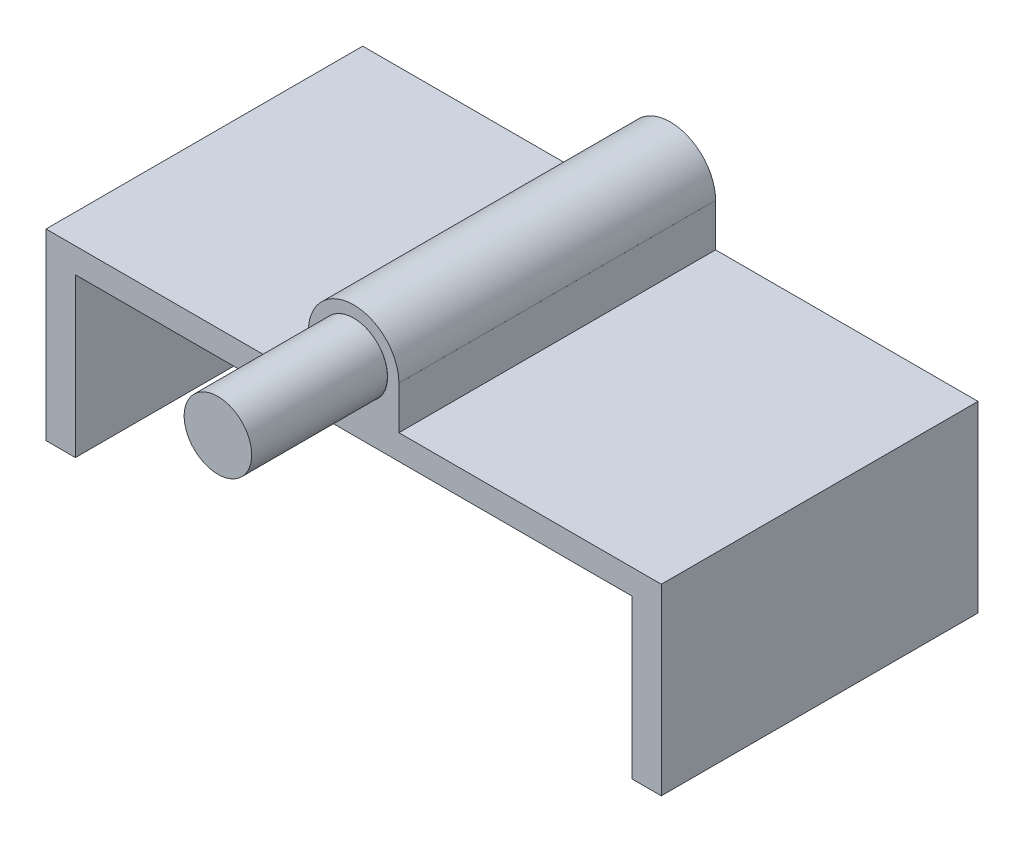
ISO-10303-21;
HEADER;
FILE_DESCRIPTION(('STEP AP214'),'2;1');
FILE_NAME('part.step','',(''),(''),'','','');
FILE_SCHEMA(('AUTOMOTIVE_DESIGN { 1 0 10303 214 1 1 1 1 }'));
ENDSEC;
DATA;
#1=APPLICATION_CONTEXT('core data for automotive mechanical design processes');
#2=APPLICATION_PROTOCOL_DEFINITION('international standard','automotive_design',2000,#1);
#3=PRODUCT_CONTEXT('',#1,'mechanical');
#4=PRODUCT('Part','Part','',(#3));
#5=PRODUCT_RELATED_PRODUCT_CATEGORY('part','',(#4));
#6=PRODUCT_DEFINITION_FORMATION('','',#4);
#7=PRODUCT_DEFINITION_CONTEXT('part definition',#1,'design');
#8=PRODUCT_DEFINITION('design','',#6,#7);
#9=PRODUCT_DEFINITION_SHAPE('','',#8);
#10=(LENGTH_UNIT() NAMED_UNIT(*) SI_UNIT(.MILLI.,.METRE.));
#11=(NAMED_UNIT(*) PLANE_ANGLE_UNIT() SI_UNIT($,.RADIAN.));
#12=(NAMED_UNIT(*) SI_UNIT($,.STERADIAN.) SOLID_ANGLE_UNIT());
#13=UNCERTAINTY_MEASURE_WITH_UNIT(LENGTH_MEASURE(1.E-05),#10,'distance_accuracy_value','');
#14=(GEOMETRIC_REPRESENTATION_CONTEXT(3) GLOBAL_UNCERTAINTY_ASSIGNED_CONTEXT((#13)) GLOBAL_UNIT_ASSIGNED_CONTEXT((#10,
#11,#12)) REPRESENTATION_CONTEXT('',''));
#15=CARTESIAN_POINT('',(0.,0.,0.));
#16=DIRECTION('',(0.,0.,1.));
#17=DIRECTION('',(1.,0.,0.));
#18=AXIS2_PLACEMENT_3D('',#15,#16,#17);
#19=CARTESIAN_POINT('',(7.00000000000001,5.,10.0000000000019));
#20=DIRECTION('',(0.,0.,-1.));
#21=DIRECTION('',(-1.,0.,0.));
#22=AXIS2_PLACEMENT_3D('',#19,#20,#21);
#23=CYLINDRICAL_SURFACE('',#22,0.746179914416804);
#24=CARTESIAN_POINT('',(7.00000000000001,5.,10.0000000000019));
#25=DIRECTION('',(0.,0.,1.));
#26=DIRECTION('',(1.,0.,0.));
#27=AXIS2_PLACEMENT_3D('',#24,#25,#26);
#28=CIRCLE('',#27,0.746179914416804);
#29=CARTESIAN_POINT('',(7.74617991441681,5.,10.0000000000019));
#30=VERTEX_POINT('',#29);
#31=EDGE_CURVE('E11',#30,#30,#28,.T.);
#32=ORIENTED_EDGE('',*,*,#31,.F.);
#33=EDGE_LOOP('',(#32));
#34=FACE_BOUND('',#33,.T.);
#35=CARTESIAN_POINT('',(7.00000000000001,5.,7.00000000000189));
#36=DIRECTION('',(0.,0.,1.));
#37=DIRECTION('',(1.,0.,0.));
#38=AXIS2_PLACEMENT_3D('',#35,#36,#37);
#39=CIRCLE('',#38,0.746179914416804);
#40=CARTESIAN_POINT('',(7.74617991441681,5.,7.00000000000189));
#41=VERTEX_POINT('',#40);
#42=EDGE_CURVE('E56',#41,#41,#39,.T.);
#43=ORIENTED_EDGE('',*,*,#42,.T.);
#44=EDGE_LOOP('',(#43));
#45=FACE_BOUND('',#44,.T.);
#46=ADVANCED_FACE('F53',(#34,#45),#23,.T.);
#47=CARTESIAN_POINT('',(7.00000000000001,5.,10.0000000000019));
#48=DIRECTION('',(0.,0.,1.));
#49=DIRECTION('',(1.,0.,0.));
#50=AXIS2_PLACEMENT_3D('',#47,#48,#49);
#51=PLANE('',#50);
#52=ORIENTED_EDGE('',*,*,#31,.T.);
#53=EDGE_LOOP('',(#52));
#54=FACE_BOUND('',#53,.T.);
#55=ADVANCED_FACE('F68',(#54),#51,.T.);
#56=CARTESIAN_POINT('',(7.00000000000001,5.,7.00000000000189));
#57=DIRECTION('',(0.,0.,1.));
#58=DIRECTION('',(1.,0.,0.));
#59=AXIS2_PLACEMENT_3D('',#56,#57,#58);
#60=PLANE('',#59);
#61=ORIENTED_EDGE('',*,*,#42,.F.);
#62=EDGE_LOOP('',(#61));
#63=FACE_BOUND('',#62,.T.);
#64=ADVANCED_FACE('F66',(#63),#60,.F.);
#65=CLOSED_SHELL('',(#46,#55,#64));
#66=MANIFOLD_SOLID_BREP('B2',#65);
#67=CARTESIAN_POINT('',(0.,0.,7.00000000000189));
#68=DIRECTION('',(0.,1.,0.));
#69=DIRECTION('',(0.,0.,1.));
#70=AXIS2_PLACEMENT_3D('',#67,#68,#69);
#71=PLANE('',#70);
#72=DIRECTION('',(0.,0.,1.));
#73=VECTOR('',#72,1.);
#74=CARTESIAN_POINT('',(13.15,0.,0.));
#75=LINE('',#74,#73);
#76=CARTESIAN_POINT('',(13.15,0.,0.));
#77=VERTEX_POINT('',#76);
#78=CARTESIAN_POINT('',(13.15,0.,7.00000000000189));
#79=VERTEX_POINT('',#78);
#80=EDGE_CURVE('E200',#77,#79,#75,.T.);
#81=ORIENTED_EDGE('',*,*,#80,.F.);
#82=DIRECTION('',(1.,0.,0.));
#83=VECTOR('',#82,1.);
#84=CARTESIAN_POINT('',(0.,0.,0.));
#85=LINE('',#84,#83);
#86=CARTESIAN_POINT('',(13.8,0.,0.));
#87=VERTEX_POINT('',#86);
#88=EDGE_CURVE('E210',#77,#87,#85,.T.);
#89=ORIENTED_EDGE('',*,*,#88,.T.);
#90=DIRECTION('',(0.,0.,-1.));
#91=VECTOR('',#90,1.);
#92=CARTESIAN_POINT('',(13.8,0.,7.00000000000001));
#93=LINE('',#92,#91);
#94=CARTESIAN_POINT('',(13.8,0.,7.00000000000001));
#95=VERTEX_POINT('',#94);
#96=EDGE_CURVE('E254',#95,#87,#93,.T.);
#97=ORIENTED_EDGE('',*,*,#96,.F.);
#98=DIRECTION('',(1.,0.,0.));
#99=VECTOR('',#98,1.);
#100=CARTESIAN_POINT('',(0.,0.,7.00000000000189));
#101=LINE('',#100,#99);
#102=EDGE_CURVE('E212',#79,#95,#101,.T.);
#103=ORIENTED_EDGE('',*,*,#102,.F.);
#104=EDGE_LOOP('',(#81,#89,#97,#103));
#105=FACE_BOUND('',#104,.T.);
#106=ADVANCED_FACE('F94',(#105),#71,.F.);
#107=CARTESIAN_POINT('',(0.,0.,7.00000000000189));
#108=DIRECTION('',(0.,0.,-1.));
#109=DIRECTION('',(-1.,0.,0.));
#110=AXIS2_PLACEMENT_3D('',#107,#108,#109);
#111=PLANE('',#110);
#112=CARTESIAN_POINT('',(7.00000000000001,4.99617991441681,7.00000000000189));
#113=DIRECTION('',(0.,0.,1.));
#114=DIRECTION('',(1.,0.,0.));
#115=AXIS2_PLACEMENT_3D('',#112,#113,#114);
#116=CIRCLE('',#115,0.749999999999999);
#117=CARTESIAN_POINT('',(7.00000000000001,5.74617991441681,7.00000000000189));
#118=VERTEX_POINT('',#117);
#119=EDGE_CURVE('E107',#118,#118,#116,.T.);
#120=ORIENTED_EDGE('',*,*,#119,.F.);
#121=EDGE_LOOP('',(#120));
#122=FACE_BOUND('',#121,.T.);
#123=DIRECTION('',(-1.,0.,0.));
#124=VECTOR('',#123,1.);
#125=CARTESIAN_POINT('',(1.,3.5,7.00000000000189));
#126=LINE('',#125,#124);
#127=CARTESIAN_POINT('',(13.15,3.5,7.00000000000189));
#128=VERTEX_POINT('',#127);
#129=CARTESIAN_POINT('',(0.850000000000001,3.5,7.00000000000189));
#130=VERTEX_POINT('',#129);
#131=EDGE_CURVE('E230',#128,#130,#126,.T.);
#132=ORIENTED_EDGE('',*,*,#131,.F.);
#133=DIRECTION('',(0.,1.,0.));
#134=VECTOR('',#133,1.);
#135=CARTESIAN_POINT('',(13.15,3.5,7.00000000000189));
#136=LINE('',#135,#134);
#137=EDGE_CURVE('E213',#79,#128,#136,.T.);
#138=ORIENTED_EDGE('',*,*,#137,.F.);
#139=ORIENTED_EDGE('',*,*,#102,.T.);
#140=DIRECTION('',(0.,-1.,0.));
#141=VECTOR('',#140,1.);
#142=CARTESIAN_POINT('',(13.8,4.05146590855115,7.00000000000001));
#143=LINE('',#142,#141);
#144=CARTESIAN_POINT('',(13.8,4.05146590855115,7.00000000000001));
#145=VERTEX_POINT('',#144);
#146=EDGE_CURVE('E253',#145,#95,#143,.T.);
#147=ORIENTED_EDGE('',*,*,#146,.F.);
#148=DIRECTION('',(1.,0.,0.));
#149=VECTOR('',#148,1.);
#150=CARTESIAN_POINT('',(0.,4.05146590855115,7.00000000000001));
#151=LINE('',#150,#149);
#152=CARTESIAN_POINT('',(8.00000000000001,4.05146590855115,7.00000000000001));
#153=VERTEX_POINT('',#152);
#154=EDGE_CURVE('E332',#153,#145,#151,.T.);
#155=ORIENTED_EDGE('',*,*,#154,.F.);
#156=DIRECTION('',(0.,1.,0.));
#157=VECTOR('',#156,1.);
#158=CARTESIAN_POINT('',(8.00000000000001,4.05146590855115,7.00000000000001));
#159=LINE('',#158,#157);
#160=CARTESIAN_POINT('',(8.00000000000001,5.,7.00000000000001));
#161=VERTEX_POINT('',#160);
#162=EDGE_CURVE('E300',#153,#161,#159,.T.);
#163=ORIENTED_EDGE('',*,*,#162,.T.);
#164=DIRECTION('',(-1.,0.,0.));
#165=VECTOR('',#164,1.);
#166=CARTESIAN_POINT('',(6.00000000000001,5.,7.00000000000001));
#167=LINE('',#166,#165);
#168=CARTESIAN_POINT('',(7.99967631657733,5.,7.00000000000001));
#169=VERTEX_POINT('',#168);
#170=EDGE_CURVE('E295',#161,#169,#167,.T.);
#171=ORIENTED_EDGE('',*,*,#170,.T.);
#172=CARTESIAN_POINT('',(7.00000000000001,5.,7.00000000000001));
#173=DIRECTION('',(0.,0.,1.));
#174=DIRECTION('',(1.,0.,0.));
#175=AXIS2_PLACEMENT_3D('',#172,#173,#174);
#176=CIRCLE('',#175,0.999676316577325);
#177=CARTESIAN_POINT('',(6.00032368342268,5.,7.00000000000001));
#178=VERTEX_POINT('',#177);
#179=EDGE_CURVE('E287',#169,#178,#176,.T.);
#180=ORIENTED_EDGE('',*,*,#179,.T.);
#181=CARTESIAN_POINT('',(6.00000000000001,5.,7.00000000000001));
#182=VERTEX_POINT('',#181);
#183=EDGE_CURVE('E114',#178,#182,#167,.T.);
#184=ORIENTED_EDGE('',*,*,#183,.T.);
#185=DIRECTION('',(0.,-1.,0.));
#186=VECTOR('',#185,1.);
#187=CARTESIAN_POINT('',(6.00000000000001,4.05146590855115,7.00000000000001));
#188=LINE('',#187,#186);
#189=CARTESIAN_POINT('',(6.00000000000001,4.05146590855115,7.00000000000001));
#190=VERTEX_POINT('',#189);
#191=EDGE_CURVE('E294',#182,#190,#188,.T.);
#192=ORIENTED_EDGE('',*,*,#191,.T.);
#193=CARTESIAN_POINT('',(0.2,4.05146590855115,7.00000000000189));
#194=VERTEX_POINT('',#193);
#195=EDGE_CURVE('E333',#194,#190,#151,.T.);
#196=ORIENTED_EDGE('',*,*,#195,.F.);
#197=DIRECTION('',(0.,1.,0.));
#198=VECTOR('',#197,1.);
#199=CARTESIAN_POINT('',(0.2,4.05146590855115,7.00000000000189));
#200=LINE('',#199,#198);
#201=CARTESIAN_POINT('',(0.2,0.,7.00000000000189));
#202=VERTEX_POINT('',#201);
#203=EDGE_CURVE('E275',#202,#194,#200,.T.);
#204=ORIENTED_EDGE('',*,*,#203,.F.);
#205=CARTESIAN_POINT('',(0.850000000000001,0.,7.00000000000189));
#206=VERTEX_POINT('',#205);
#207=EDGE_CURVE('E233',#202,#206,#101,.T.);
#208=ORIENTED_EDGE('',*,*,#207,.T.);
#209=DIRECTION('',(0.,-1.,0.));
#210=VECTOR('',#209,1.);
#211=CARTESIAN_POINT('',(0.850000000000001,3.5,7.00000000000189));
#212=LINE('',#211,#210);
#213=EDGE_CURVE('E263',#130,#206,#212,.T.);
#214=ORIENTED_EDGE('',*,*,#213,.F.);
#215=EDGE_LOOP('',(#132,#138,#139,#147,#155,#163,#171,#180,#184,#192,#196,#204,#208,#214));
#216=FACE_BOUND('',#215,.T.);
#217=ADVANCED_FACE('F250',(#122,#216),#111,.F.);
#218=CARTESIAN_POINT('',(0.,0.,0.));
#219=DIRECTION('',(0.,0.,-1.));
#220=DIRECTION('',(-1.,0.,0.));
#221=AXIS2_PLACEMENT_3D('',#218,#219,#220);
#222=PLANE('',#221);
#223=DIRECTION('',(0.,-1.,0.));
#224=VECTOR('',#223,1.);
#225=CARTESIAN_POINT('',(13.15,3.5,0.));
#226=LINE('',#225,#224);
#227=CARTESIAN_POINT('',(13.15,3.5,0.));
#228=VERTEX_POINT('',#227);
#229=EDGE_CURVE('E196',#228,#77,#226,.T.);
#230=ORIENTED_EDGE('',*,*,#229,.F.);
#231=DIRECTION('',(-1.,0.,0.));
#232=VECTOR('',#231,1.);
#233=CARTESIAN_POINT('',(1.,3.5,0.));
#234=LINE('',#233,#232);
#235=CARTESIAN_POINT('',(0.850000000000001,3.5,0.));
#236=VERTEX_POINT('',#235);
#237=EDGE_CURVE('E222',#228,#236,#234,.T.);
#238=ORIENTED_EDGE('',*,*,#237,.T.);
#239=DIRECTION('',(0.,1.,0.));
#240=VECTOR('',#239,1.);
#241=CARTESIAN_POINT('',(0.850000000000001,3.5,0.));
#242=LINE('',#241,#240);
#243=CARTESIAN_POINT('',(0.850000000000001,0.,0.));
#244=VERTEX_POINT('',#243);
#245=EDGE_CURVE('E351',#244,#236,#242,.T.);
#246=ORIENTED_EDGE('',*,*,#245,.F.);
#247=CARTESIAN_POINT('',(0.2,0.,0.));
#248=VERTEX_POINT('',#247);
#249=EDGE_CURVE('E221',#248,#244,#85,.T.);
#250=ORIENTED_EDGE('',*,*,#249,.F.);
#251=DIRECTION('',(0.,-1.,0.));
#252=VECTOR('',#251,1.);
#253=CARTESIAN_POINT('',(0.2,4.05146590855115,0.));
#254=LINE('',#253,#252);
#255=CARTESIAN_POINT('',(0.2,4.05146590855115,0.));
#256=VERTEX_POINT('',#255);
#257=EDGE_CURVE('E269',#256,#248,#254,.T.);
#258=ORIENTED_EDGE('',*,*,#257,.F.);
#259=DIRECTION('',(1.,0.,0.));
#260=VECTOR('',#259,1.);
#261=CARTESIAN_POINT('',(0.,4.05146590855115,0.));
#262=LINE('',#261,#260);
#263=CARTESIAN_POINT('',(6.00000000000001,4.05146590855115,0.));
#264=VERTEX_POINT('',#263);
#265=EDGE_CURVE('E336',#256,#264,#262,.T.);
#266=ORIENTED_EDGE('',*,*,#265,.T.);
#267=DIRECTION('',(0.,-1.,0.));
#268=VECTOR('',#267,1.);
#269=CARTESIAN_POINT('',(6.00000000000001,4.05146590855115,0.));
#270=LINE('',#269,#268);
#271=CARTESIAN_POINT('',(6.00000000000001,5.,1.88737914186277E-12));
#272=VERTEX_POINT('',#271);
#273=EDGE_CURVE('E307',#272,#264,#270,.T.);
#274=ORIENTED_EDGE('',*,*,#273,.F.);
#275=DIRECTION('',(-1.,0.,0.));
#276=VECTOR('',#275,1.);
#277=CARTESIAN_POINT('',(6.00000000000001,5.,1.88737914186277E-12));
#278=LINE('',#277,#276);
#279=CARTESIAN_POINT('',(6.00032368342268,5.,1.88737914186277E-12));
#280=VERTEX_POINT('',#279);
#281=EDGE_CURVE('E316',#280,#272,#278,.T.);
#282=ORIENTED_EDGE('',*,*,#281,.F.);
#283=CARTESIAN_POINT('',(7.00000000000001,5.,1.88737914186277E-12));
#284=DIRECTION('',(0.,0.,-1.));
#285=DIRECTION('',(-1.,0.,0.));
#286=AXIS2_PLACEMENT_3D('',#283,#284,#285);
#287=CIRCLE('',#286,0.999676316577325);
#288=CARTESIAN_POINT('',(7.99967631657733,5.,1.88737914186277E-12));
#289=VERTEX_POINT('',#288);
#290=EDGE_CURVE('E291',#289,#280,#287,.F.);
#291=ORIENTED_EDGE('',*,*,#290,.F.);
#292=CARTESIAN_POINT('',(8.00000000000001,5.,1.88737914186277E-12));
#293=VERTEX_POINT('',#292);
#294=EDGE_CURVE('E313',#293,#289,#278,.T.);
#295=ORIENTED_EDGE('',*,*,#294,.F.);
#296=DIRECTION('',(0.,1.,0.));
#297=VECTOR('',#296,1.);
#298=CARTESIAN_POINT('',(8.00000000000001,4.05146590855115,0.));
#299=LINE('',#298,#297);
#300=CARTESIAN_POINT('',(8.00000000000001,4.05146590855115,0.));
#301=VERTEX_POINT('',#300);
#302=EDGE_CURVE('E317',#301,#293,#299,.T.);
#303=ORIENTED_EDGE('',*,*,#302,.F.);
#304=CARTESIAN_POINT('',(13.8,4.05146590855115,0.));
#305=VERTEX_POINT('',#304);
#306=EDGE_CURVE('E335',#301,#305,#262,.T.);
#307=ORIENTED_EDGE('',*,*,#306,.T.);
#308=DIRECTION('',(0.,1.,0.));
#309=VECTOR('',#308,1.);
#310=CARTESIAN_POINT('',(13.8,4.05146590855115,0.));
#311=LINE('',#310,#309);
#312=EDGE_CURVE('E219',#87,#305,#311,.T.);
#313=ORIENTED_EDGE('',*,*,#312,.F.);
#314=ORIENTED_EDGE('',*,*,#88,.F.);
#315=EDGE_LOOP('',(#230,#238,#246,#250,#258,#266,#274,#282,#291,#295,#303,#307,#313,#314));
#316=FACE_BOUND('',#315,.T.);
#317=CARTESIAN_POINT('',(7.00000000000001,4.99617991441678,0.));
#318=DIRECTION('',(0.,0.,-1.));
#319=DIRECTION('',(-1.,0.,0.));
#320=AXIS2_PLACEMENT_3D('',#317,#318,#319);
#321=CIRCLE('',#320,0.749999999999999);
#322=CARTESIAN_POINT('',(6.25000000000001,4.99617991441678,0.));
#323=VERTEX_POINT('',#322);
#324=EDGE_CURVE('E283',#323,#323,#321,.F.);
#325=ORIENTED_EDGE('',*,*,#324,.T.);
#326=EDGE_LOOP('',(#325));
#327=FACE_BOUND('',#326,.T.);
#328=ADVANCED_FACE('F216',(#316,#327),#222,.T.);
#329=CARTESIAN_POINT('',(0.,4.05146590855115,-14.0320959561514));
#330=DIRECTION('',(0.,-1.,0.));
#331=DIRECTION('',(0.,0.,-1.));
#332=AXIS2_PLACEMENT_3D('',#329,#330,#331);
#333=PLANE('',#332);
#334=ORIENTED_EDGE('',*,*,#154,.T.);
#335=DIRECTION('',(0.,0.,1.));
#336=VECTOR('',#335,1.);
#337=CARTESIAN_POINT('',(13.8,4.05146590855115,7.00000000000001));
#338=LINE('',#337,#336);
#339=EDGE_CURVE('E260',#305,#145,#338,.T.);
#340=ORIENTED_EDGE('',*,*,#339,.F.);
#341=ORIENTED_EDGE('',*,*,#306,.F.);
#342=DIRECTION('',(0.,0.,1.));
#343=VECTOR('',#342,1.);
#344=CARTESIAN_POINT('',(8.00000000000001,4.05146590855115,-2.21353042053463));
#345=LINE('',#344,#343);
#346=EDGE_CURVE('E299',#301,#153,#345,.T.);
#347=ORIENTED_EDGE('',*,*,#346,.T.);
#348=EDGE_LOOP('',(#334,#340,#341,#347));
#349=FACE_BOUND('',#348,.T.);
#350=ADVANCED_FACE('F400',(#349),#333,.F.);
#351=ORIENTED_EDGE('',*,*,#265,.F.);
#352=DIRECTION('',(0.,0.,-1.));
#353=VECTOR('',#352,1.);
#354=CARTESIAN_POINT('',(0.2,4.05146590855115,0.));
#355=LINE('',#354,#353);
#356=EDGE_CURVE('E278',#194,#256,#355,.T.);
#357=ORIENTED_EDGE('',*,*,#356,.F.);
#358=ORIENTED_EDGE('',*,*,#195,.T.);
#359=DIRECTION('',(0.,0.,1.));
#360=VECTOR('',#359,1.);
#361=CARTESIAN_POINT('',(6.00000000000001,4.05146590855115,-2.21353042053463));
#362=LINE('',#361,#360);
#363=EDGE_CURVE('E311',#264,#190,#362,.T.);
#364=ORIENTED_EDGE('',*,*,#363,.F.);
#365=EDGE_LOOP('',(#351,#357,#358,#364));
#366=FACE_BOUND('',#365,.T.);
#367=ADVANCED_FACE('F371',(#366),#333,.F.);
#368=ORIENTED_EDGE('',*,*,#249,.T.);
#369=DIRECTION('',(0.,0.,-1.));
#370=VECTOR('',#369,1.);
#371=CARTESIAN_POINT('',(0.850000000000001,0.,0.));
#372=LINE('',#371,#370);
#373=EDGE_CURVE('E261',#206,#244,#372,.T.);
#374=ORIENTED_EDGE('',*,*,#373,.F.);
#375=ORIENTED_EDGE('',*,*,#207,.F.);
#376=DIRECTION('',(0.,0.,1.));
#377=VECTOR('',#376,1.);
#378=CARTESIAN_POINT('',(0.2,0.,0.));
#379=LINE('',#378,#377);
#380=EDGE_CURVE('E272',#248,#202,#379,.T.);
#381=ORIENTED_EDGE('',*,*,#380,.F.);
#382=EDGE_LOOP('',(#368,#374,#375,#381));
#383=FACE_BOUND('',#382,.T.);
#384=ADVANCED_FACE('F359',(#383),#71,.F.);
#385=CARTESIAN_POINT('',(6.00000000000001,5.,-2.21353042053463));
#386=DIRECTION('',(0.,1.,0.));
#387=DIRECTION('',(0.,0.,1.));
#388=AXIS2_PLACEMENT_3D('',#385,#386,#387);
#389=PLANE('',#388);
#390=DIRECTION('',(0.,0.,1.));
#391=VECTOR('',#390,1.);
#392=CARTESIAN_POINT('',(6.00032368342268,5.,-2.82751160977179));
#393=LINE('',#392,#391);
#394=EDGE_CURVE('E51',#280,#178,#393,.T.);
#395=ORIENTED_EDGE('',*,*,#394,.F.);
#396=ORIENTED_EDGE('',*,*,#281,.T.);
#397=DIRECTION('',(0.,0.,1.));
#398=VECTOR('',#397,1.);
#399=CARTESIAN_POINT('',(6.00000000000001,5.,-2.21353042053463));
#400=LINE('',#399,#398);
#401=EDGE_CURVE('E312',#272,#182,#400,.T.);
#402=ORIENTED_EDGE('',*,*,#401,.T.);
#403=ORIENTED_EDGE('',*,*,#183,.F.);
#404=EDGE_LOOP('',(#395,#396,#402,#403));
#405=FACE_BOUND('',#404,.T.);
#406=ADVANCED_FACE('F373',(#405),#389,.T.);
#407=CARTESIAN_POINT('',(1.,3.5,0.));
#408=DIRECTION('',(0.,1.,0.));
#409=DIRECTION('',(0.,0.,1.));
#410=AXIS2_PLACEMENT_3D('',#407,#408,#409);
#411=PLANE('',#410);
#412=ORIENTED_EDGE('',*,*,#131,.T.);
#413=DIRECTION('',(0.,0.,1.));
#414=VECTOR('',#413,1.);
#415=CARTESIAN_POINT('',(0.850000000000001,3.5,0.));
#416=LINE('',#415,#414);
#417=EDGE_CURVE('E345',#236,#130,#416,.T.);
#418=ORIENTED_EDGE('',*,*,#417,.F.);
#419=ORIENTED_EDGE('',*,*,#237,.F.);
#420=DIRECTION('',(0.,0.,-1.));
#421=VECTOR('',#420,1.);
#422=CARTESIAN_POINT('',(13.15,3.5,0.));
#423=LINE('',#422,#421);
#424=EDGE_CURVE('E203',#128,#228,#423,.T.);
#425=ORIENTED_EDGE('',*,*,#424,.F.);
#426=EDGE_LOOP('',(#412,#418,#419,#425));
#427=FACE_BOUND('',#426,.T.);
#428=ADVANCED_FACE('F344',(#427),#411,.F.);
#429=CARTESIAN_POINT('',(8.00000000000001,4.05146590855115,-2.21353042053463));
#430=DIRECTION('',(1.,0.,0.));
#431=DIRECTION('',(0.,0.,-1.));
#432=AXIS2_PLACEMENT_3D('',#429,#430,#431);
#433=PLANE('',#432);
#434=ORIENTED_EDGE('',*,*,#346,.F.);
#435=ORIENTED_EDGE('',*,*,#302,.T.);
#436=DIRECTION('',(0.,0.,1.));
#437=VECTOR('',#436,1.);
#438=CARTESIAN_POINT('',(8.00000000000001,5.,-2.21353042053463));
#439=LINE('',#438,#437);
#440=EDGE_CURVE('E321',#293,#161,#439,.T.);
#441=ORIENTED_EDGE('',*,*,#440,.T.);
#442=ORIENTED_EDGE('',*,*,#162,.F.);
#443=EDGE_LOOP('',(#434,#435,#441,#442));
#444=FACE_BOUND('',#443,.T.);
#445=ADVANCED_FACE('F438',(#444),#433,.T.);
#446=DIRECTION('',(0.,0.,1.));
#447=VECTOR('',#446,1.);
#448=CARTESIAN_POINT('',(7.99967631657733,5.,-2.82751160977179));
#449=LINE('',#448,#447);
#450=EDGE_CURVE('E102',#169,#289,#449,.F.);
#451=ORIENTED_EDGE('',*,*,#450,.F.);
#452=ORIENTED_EDGE('',*,*,#170,.F.);
#453=ORIENTED_EDGE('',*,*,#440,.F.);
#454=ORIENTED_EDGE('',*,*,#294,.T.);
#455=EDGE_LOOP('',(#451,#452,#453,#454));
#456=FACE_BOUND('',#455,.T.);
#457=ADVANCED_FACE('F405',(#456),#389,.T.);
#458=CARTESIAN_POINT('',(6.00000000000001,4.05146590855115,-2.21353042053463));
#459=DIRECTION('',(-1.,0.,0.));
#460=DIRECTION('',(0.,0.,1.));
#461=AXIS2_PLACEMENT_3D('',#458,#459,#460);
#462=PLANE('',#461);
#463=ORIENTED_EDGE('',*,*,#401,.F.);
#464=ORIENTED_EDGE('',*,*,#273,.T.);
#465=ORIENTED_EDGE('',*,*,#363,.T.);
#466=ORIENTED_EDGE('',*,*,#191,.F.);
#467=EDGE_LOOP('',(#463,#464,#465,#466));
#468=FACE_BOUND('',#467,.T.);
#469=ADVANCED_FACE('F369',(#468),#462,.T.);
#470=CARTESIAN_POINT('',(7.00000000000001,5.,-2.82751160977179));
#471=DIRECTION('',(0.,0.,1.));
#472=DIRECTION('',(1.,0.,0.));
#473=AXIS2_PLACEMENT_3D('',#470,#471,#472);
#474=CYLINDRICAL_SURFACE('',#473,0.999676316577325);
#475=ORIENTED_EDGE('',*,*,#290,.T.);
#476=ORIENTED_EDGE('',*,*,#394,.T.);
#477=ORIENTED_EDGE('',*,*,#179,.F.);
#478=ORIENTED_EDGE('',*,*,#450,.T.);
#479=EDGE_LOOP('',(#475,#476,#477,#478));
#480=FACE_BOUND('',#479,.T.);
#481=ADVANCED_FACE('F406',(#480),#474,.T.);
#482=CARTESIAN_POINT('',(7.00000000000001,4.99617991441681,-2.12132034355961));
#483=DIRECTION('',(0.,0.,1.));
#484=DIRECTION('',(1.,0.,0.));
#485=AXIS2_PLACEMENT_3D('',#482,#483,#484);
#486=CYLINDRICAL_SURFACE('',#485,0.749999999999999);
#487=ORIENTED_EDGE('',*,*,#119,.T.);
#488=EDGE_LOOP('',(#487));
#489=FACE_BOUND('',#488,.T.);
#490=ORIENTED_EDGE('',*,*,#324,.F.);
#491=EDGE_LOOP('',(#490));
#492=FACE_BOUND('',#491,.T.);
#493=ADVANCED_FACE('F408',(#489,#492),#486,.F.);
#494=CARTESIAN_POINT('',(0.2,0.,0.));
#495=DIRECTION('',(-1.,0.,0.));
#496=DIRECTION('',(0.,0.,1.));
#497=AXIS2_PLACEMENT_3D('',#494,#495,#496);
#498=PLANE('',#497);
#499=ORIENTED_EDGE('',*,*,#257,.T.);
#500=ORIENTED_EDGE('',*,*,#380,.T.);
#501=ORIENTED_EDGE('',*,*,#203,.T.);
#502=ORIENTED_EDGE('',*,*,#356,.T.);
#503=EDGE_LOOP('',(#499,#500,#501,#502));
#504=FACE_BOUND('',#503,.T.);
#505=ADVANCED_FACE('F361',(#504),#498,.T.);
#506=CARTESIAN_POINT('',(13.8,0.,0.));
#507=DIRECTION('',(1.,0.,0.));
#508=DIRECTION('',(0.,0.,-1.));
#509=AXIS2_PLACEMENT_3D('',#506,#507,#508);
#510=PLANE('',#509);
#511=ORIENTED_EDGE('',*,*,#146,.T.);
#512=ORIENTED_EDGE('',*,*,#96,.T.);
#513=ORIENTED_EDGE('',*,*,#312,.T.);
#514=ORIENTED_EDGE('',*,*,#339,.T.);
#515=EDGE_LOOP('',(#511,#512,#513,#514));
#516=FACE_BOUND('',#515,.T.);
#517=ADVANCED_FACE('F258',(#516),#510,.T.);
#518=CARTESIAN_POINT('',(0.850000000000001,0.,0.));
#519=DIRECTION('',(-1.,0.,0.));
#520=DIRECTION('',(0.,0.,1.));
#521=AXIS2_PLACEMENT_3D('',#518,#519,#520);
#522=PLANE('',#521);
#523=ORIENTED_EDGE('',*,*,#245,.T.);
#524=ORIENTED_EDGE('',*,*,#417,.T.);
#525=ORIENTED_EDGE('',*,*,#213,.T.);
#526=ORIENTED_EDGE('',*,*,#373,.T.);
#527=EDGE_LOOP('',(#523,#524,#525,#526));
#528=FACE_BOUND('',#527,.T.);
#529=ADVANCED_FACE('F348',(#528),#522,.F.);
#530=CARTESIAN_POINT('',(13.15,0.,0.));
#531=DIRECTION('',(-1.,0.,0.));
#532=DIRECTION('',(0.,0.,1.));
#533=AXIS2_PLACEMENT_3D('',#530,#531,#532);
#534=PLANE('',#533);
#535=ORIENTED_EDGE('',*,*,#229,.T.);
#536=ORIENTED_EDGE('',*,*,#80,.T.);
#537=ORIENTED_EDGE('',*,*,#137,.T.);
#538=ORIENTED_EDGE('',*,*,#424,.T.);
#539=EDGE_LOOP('',(#535,#536,#537,#538));
#540=FACE_BOUND('',#539,.T.);
#541=ADVANCED_FACE('F198',(#540),#534,.T.);
#542=CLOSED_SHELL('',(#106,#217,#328,#350,#367,#384,#406,#428,#445,#457,#469,#481,#493,#505,
#517,#529,#541));
#543=MANIFOLD_SOLID_BREP('B6',#542);
#544=ADVANCED_BREP_SHAPE_REPRESENTATION('',(#18,#66,#543),#14);
#545=SHAPE_DEFINITION_REPRESENTATION(#9,#544);
ENDSEC;
END-ISO-10303-21;
